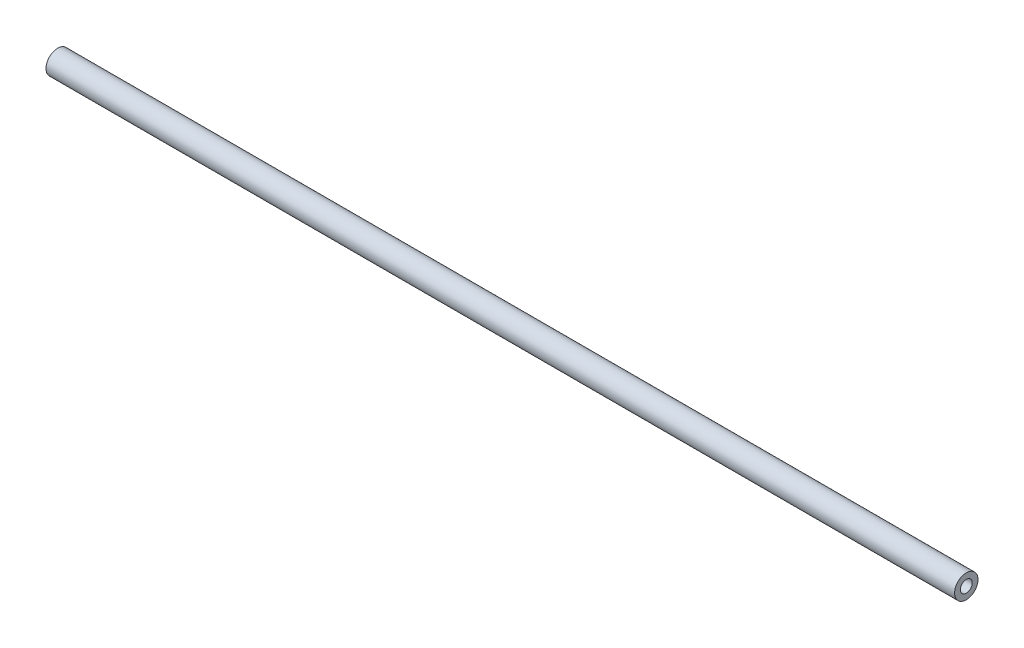
ISO-10303-21;
HEADER;
FILE_DESCRIPTION(('STEP AP214'),'2;1');
FILE_NAME('part.step','',(''),(''),'','','');
FILE_SCHEMA(('AUTOMOTIVE_DESIGN { 1 0 10303 214 1 1 1 1 }'));
ENDSEC;
DATA;
#1=APPLICATION_CONTEXT('core data for automotive mechanical design processes');
#2=APPLICATION_PROTOCOL_DEFINITION('international standard','automotive_design',2000,#1);
#3=PRODUCT_CONTEXT('',#1,'mechanical');
#4=PRODUCT('Part','Part','',(#3));
#5=PRODUCT_RELATED_PRODUCT_CATEGORY('part','',(#4));
#6=PRODUCT_DEFINITION_FORMATION('','',#4);
#7=PRODUCT_DEFINITION_CONTEXT('part definition',#1,'design');
#8=PRODUCT_DEFINITION('design','',#6,#7);
#9=PRODUCT_DEFINITION_SHAPE('','',#8);
#10=(LENGTH_UNIT() NAMED_UNIT(*) SI_UNIT(.MILLI.,.METRE.));
#11=(NAMED_UNIT(*) PLANE_ANGLE_UNIT() SI_UNIT($,.RADIAN.));
#12=(NAMED_UNIT(*) SI_UNIT($,.STERADIAN.) SOLID_ANGLE_UNIT());
#13=UNCERTAINTY_MEASURE_WITH_UNIT(LENGTH_MEASURE(1.E-05),#10,'distance_accuracy_value','');
#14=(GEOMETRIC_REPRESENTATION_CONTEXT(3) GLOBAL_UNCERTAINTY_ASSIGNED_CONTEXT((#13)) GLOBAL_UNIT_ASSIGNED_CONTEXT((#10,
#11,#12)) REPRESENTATION_CONTEXT('',''));
#15=CARTESIAN_POINT('',(0.,0.,0.));
#16=DIRECTION('',(0.,0.,1.));
#17=DIRECTION('',(1.,0.,0.));
#18=AXIS2_PLACEMENT_3D('',#15,#16,#17);
#19=CARTESIAN_POINT('',(153.9875,0.,0.));
#20=DIRECTION('',(-1.,0.,0.));
#21=DIRECTION('',(0.,0.,1.));
#22=AXIS2_PLACEMENT_3D('',#19,#20,#21);
#23=CYLINDRICAL_SURFACE('',#22,3.96875);
#24=CARTESIAN_POINT('',(153.9875,0.,0.));
#25=DIRECTION('',(1.,0.,0.));
#26=DIRECTION('',(0.,0.,-1.));
#27=AXIS2_PLACEMENT_3D('',#24,#25,#26);
#28=CIRCLE('',#27,3.96875);
#29=CARTESIAN_POINT('',(153.9875,0.,-3.96875));
#30=VERTEX_POINT('',#29);
#31=EDGE_CURVE('E10',#30,#30,#28,.T.);
#32=ORIENTED_EDGE('',*,*,#31,.F.);
#33=EDGE_LOOP('',(#32));
#34=FACE_BOUND('',#33,.T.);
#35=CARTESIAN_POINT('',(-153.9875,0.,0.));
#36=DIRECTION('',(1.,0.,0.));
#37=DIRECTION('',(0.,0.,-1.));
#38=AXIS2_PLACEMENT_3D('',#35,#36,#37);
#39=CIRCLE('',#38,3.96875);
#40=CARTESIAN_POINT('',(-153.9875,0.,-3.96875));
#41=VERTEX_POINT('',#40);
#42=EDGE_CURVE('E50',#41,#41,#39,.T.);
#43=ORIENTED_EDGE('',*,*,#42,.T.);
#44=EDGE_LOOP('',(#43));
#45=FACE_BOUND('',#44,.T.);
#46=ADVANCED_FACE('F43',(#34,#45),#23,.T.);
#47=CARTESIAN_POINT('',(153.9875,0.,0.));
#48=DIRECTION('',(1.,0.,0.));
#49=DIRECTION('',(0.,0.,-1.));
#50=AXIS2_PLACEMENT_3D('',#47,#48,#49);
#51=PLANE('',#50);
#52=CARTESIAN_POINT('',(153.9875,0.,0.));
#53=DIRECTION('',(1.,0.,0.));
#54=DIRECTION('',(0.,0.,-1.));
#55=AXIS2_PLACEMENT_3D('',#52,#53,#54);
#56=CIRCLE('',#55,2.01929999999999);
#57=CARTESIAN_POINT('',(153.9875,0.,-2.01929999999999));
#58=VERTEX_POINT('',#57);
#59=EDGE_CURVE('E70',#58,#58,#56,.T.);
#60=ORIENTED_EDGE('',*,*,#59,.F.);
#61=EDGE_LOOP('',(#60));
#62=FACE_BOUND('',#61,.T.);
#63=ORIENTED_EDGE('',*,*,#31,.T.);
#64=EDGE_LOOP('',(#63));
#65=FACE_BOUND('',#64,.T.);
#66=ADVANCED_FACE('F80',(#62,#65),#51,.T.);
#67=CARTESIAN_POINT('',(-153.9875,0.,0.));
#68=DIRECTION('',(1.,0.,0.));
#69=DIRECTION('',(0.,0.,-1.));
#70=AXIS2_PLACEMENT_3D('',#67,#68,#69);
#71=PLANE('',#70);
#72=CARTESIAN_POINT('',(-153.9875,0.,0.));
#73=DIRECTION('',(-1.,0.,0.));
#74=DIRECTION('',(0.,0.,1.));
#75=AXIS2_PLACEMENT_3D('',#72,#73,#74);
#76=CIRCLE('',#75,2.01929999999999);
#77=CARTESIAN_POINT('',(-153.9875,0.,2.01929999999999));
#78=VERTEX_POINT('',#77);
#79=EDGE_CURVE('E61',#78,#78,#76,.T.);
#80=ORIENTED_EDGE('',*,*,#79,.F.);
#81=EDGE_LOOP('',(#80));
#82=FACE_BOUND('',#81,.T.);
#83=ORIENTED_EDGE('',*,*,#42,.F.);
#84=EDGE_LOOP('',(#83));
#85=FACE_BOUND('',#84,.T.);
#86=ADVANCED_FACE('F82',(#82,#85),#71,.F.);
#87=CARTESIAN_POINT('',(-128.5875,0.,0.));
#88=DIRECTION('',(-1.,0.,0.));
#89=DIRECTION('',(0.,0.,1.));
#90=AXIS2_PLACEMENT_3D('',#87,#88,#89);
#91=CONICAL_SURFACE('',#90,2.0193,1.02974425867665);
#92=CARTESIAN_POINT('',(-128.30897106005,0.,0.));
#93=DIRECTION('',(-1.,0.,0.));
#94=DIRECTION('',(0.,0.,1.));
#95=AXIS2_PLACEMENT_3D('',#92,#93,#94);
#96=CIRCLE('',#95,1.55575);
#97=CARTESIAN_POINT('',(-128.30897106005,0.,1.55575));
#98=VERTEX_POINT('',#97);
#99=EDGE_CURVE('E59',#98,#98,#96,.F.);
#100=ORIENTED_EDGE('',*,*,#99,.T.);
#101=EDGE_LOOP('',(#100));
#102=FACE_BOUND('',#101,.T.);
#103=CARTESIAN_POINT('',(-128.5875,0.,0.));
#104=DIRECTION('',(-1.,0.,0.));
#105=DIRECTION('',(0.,0.,1.));
#106=AXIS2_PLACEMENT_3D('',#103,#104,#105);
#107=CIRCLE('',#106,2.0193);
#108=CARTESIAN_POINT('',(-128.5875,0.,2.0193));
#109=VERTEX_POINT('',#108);
#110=EDGE_CURVE('E55',#109,#109,#107,.T.);
#111=ORIENTED_EDGE('',*,*,#110,.T.);
#112=EDGE_LOOP('',(#111));
#113=FACE_BOUND('',#112,.T.);
#114=ADVANCED_FACE('F88',(#102,#113),#91,.F.);
#115=CARTESIAN_POINT('',(-153.9875,0.,0.));
#116=DIRECTION('',(-1.,0.,0.));
#117=DIRECTION('',(0.,0.,1.));
#118=AXIS2_PLACEMENT_3D('',#115,#116,#117);
#119=CYLINDRICAL_SURFACE('',#118,2.01929999999999);
#120=ORIENTED_EDGE('',*,*,#110,.F.);
#121=EDGE_LOOP('',(#120));
#122=FACE_BOUND('',#121,.T.);
#123=ORIENTED_EDGE('',*,*,#79,.T.);
#124=EDGE_LOOP('',(#123));
#125=FACE_BOUND('',#124,.T.);
#126=ADVANCED_FACE('F94',(#122,#125),#119,.F.);
#127=CARTESIAN_POINT('',(-153.9875,0.,0.));
#128=DIRECTION('',(1.,0.,0.));
#129=DIRECTION('',(0.,0.,-1.));
#130=AXIS2_PLACEMENT_3D('',#127,#128,#129);
#131=CYLINDRICAL_SURFACE('',#130,1.55575);
#132=CARTESIAN_POINT('',(128.30897106005,0.,0.));
#133=DIRECTION('',(1.,0.,0.));
#134=DIRECTION('',(0.,0.,-1.));
#135=AXIS2_PLACEMENT_3D('',#132,#133,#134);
#136=CIRCLE('',#135,1.55575);
#137=CARTESIAN_POINT('',(128.30897106005,0.,-1.55575));
#138=VERTEX_POINT('',#137);
#139=EDGE_CURVE('E46',#138,#138,#136,.T.);
#140=ORIENTED_EDGE('',*,*,#139,.T.);
#141=EDGE_LOOP('',(#140));
#142=FACE_BOUND('',#141,.T.);
#143=ORIENTED_EDGE('',*,*,#99,.F.);
#144=EDGE_LOOP('',(#143));
#145=FACE_BOUND('',#144,.T.);
#146=ADVANCED_FACE('F97',(#142,#145),#131,.F.);
#147=CARTESIAN_POINT('',(128.5875,0.,0.));
#148=DIRECTION('',(1.,0.,0.));
#149=DIRECTION('',(0.,0.,-1.));
#150=AXIS2_PLACEMENT_3D('',#147,#148,#149);
#151=CONICAL_SURFACE('',#150,2.0193,1.02974425867665);
#152=CARTESIAN_POINT('',(128.5875,0.,0.));
#153=DIRECTION('',(1.,0.,0.));
#154=DIRECTION('',(0.,0.,-1.));
#155=AXIS2_PLACEMENT_3D('',#152,#153,#154);
#156=CIRCLE('',#155,2.0193);
#157=CARTESIAN_POINT('',(128.5875,0.,-2.0193));
#158=VERTEX_POINT('',#157);
#159=EDGE_CURVE('E66',#158,#158,#156,.T.);
#160=ORIENTED_EDGE('',*,*,#159,.T.);
#161=EDGE_LOOP('',(#160));
#162=FACE_BOUND('',#161,.T.);
#163=ORIENTED_EDGE('',*,*,#139,.F.);
#164=EDGE_LOOP('',(#163));
#165=FACE_BOUND('',#164,.T.);
#166=ADVANCED_FACE('F101',(#162,#165),#151,.F.);
#167=CARTESIAN_POINT('',(153.9875,0.,0.));
#168=DIRECTION('',(1.,0.,0.));
#169=DIRECTION('',(0.,0.,-1.));
#170=AXIS2_PLACEMENT_3D('',#167,#168,#169);
#171=CYLINDRICAL_SURFACE('',#170,2.01929999999999);
#172=ORIENTED_EDGE('',*,*,#159,.F.);
#173=EDGE_LOOP('',(#172));
#174=FACE_BOUND('',#173,.T.);
#175=ORIENTED_EDGE('',*,*,#59,.T.);
#176=EDGE_LOOP('',(#175));
#177=FACE_BOUND('',#176,.T.);
#178=ADVANCED_FACE('F78',(#174,#177),#171,.F.);
#179=CLOSED_SHELL('',(#46,#66,#86,#114,#126,#146,#166,#178));
#180=MANIFOLD_SOLID_BREP('B2',#179);
#181=ADVANCED_BREP_SHAPE_REPRESENTATION('',(#18,#180),#14);
#182=SHAPE_DEFINITION_REPRESENTATION(#9,#181);
ENDSEC;
END-ISO-10303-21;
